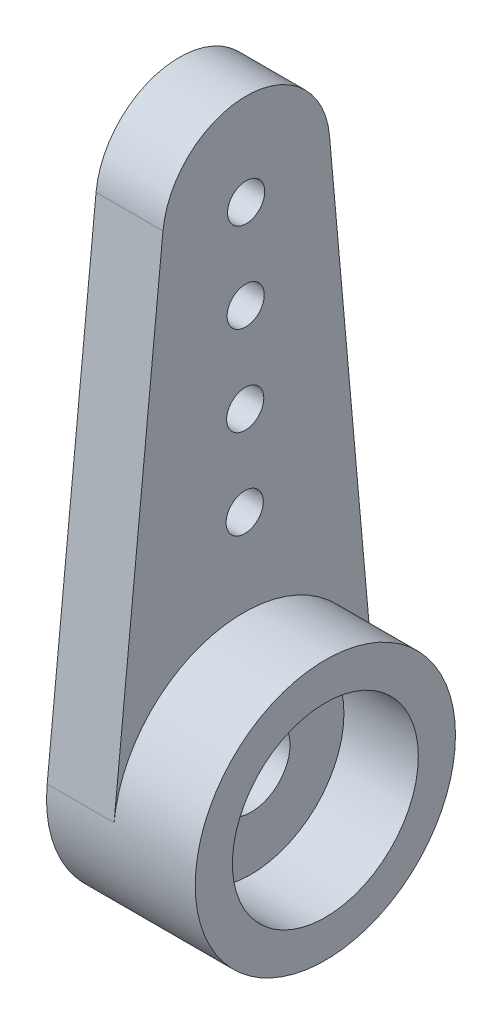
ISO-10303-21;
HEADER;
FILE_DESCRIPTION(('STEP AP214'),'2;1');
FILE_NAME('part.step','',(''),(''),'','','');
FILE_SCHEMA(('AUTOMOTIVE_DESIGN { 1 0 10303 214 1 1 1 1 }'));
ENDSEC;
DATA;
#1=APPLICATION_CONTEXT('core data for automotive mechanical design processes');
#2=APPLICATION_PROTOCOL_DEFINITION('international standard','automotive_design',2000,#1);
#3=PRODUCT_CONTEXT('',#1,'mechanical');
#4=PRODUCT('Part','Part','',(#3));
#5=PRODUCT_RELATED_PRODUCT_CATEGORY('part','',(#4));
#6=PRODUCT_DEFINITION_FORMATION('','',#4);
#7=PRODUCT_DEFINITION_CONTEXT('part definition',#1,'design');
#8=PRODUCT_DEFINITION('design','',#6,#7);
#9=PRODUCT_DEFINITION_SHAPE('','',#8);
#10=(LENGTH_UNIT() NAMED_UNIT(*) SI_UNIT(.MILLI.,.METRE.));
#11=(NAMED_UNIT(*) PLANE_ANGLE_UNIT() SI_UNIT($,.RADIAN.));
#12=(NAMED_UNIT(*) SI_UNIT($,.STERADIAN.) SOLID_ANGLE_UNIT());
#13=UNCERTAINTY_MEASURE_WITH_UNIT(LENGTH_MEASURE(1.E-05),#10,'distance_accuracy_value','');
#14=(GEOMETRIC_REPRESENTATION_CONTEXT(3) GLOBAL_UNCERTAINTY_ASSIGNED_CONTEXT((#13)) GLOBAL_UNIT_ASSIGNED_CONTEXT((#10,
#11,#12)) REPRESENTATION_CONTEXT('',''));
#15=CARTESIAN_POINT('',(0.,0.,0.));
#16=DIRECTION('',(0.,0.,1.));
#17=DIRECTION('',(1.,0.,0.));
#18=AXIS2_PLACEMENT_3D('',#15,#16,#17);
#19=CARTESIAN_POINT('',(4.,415.055894203775,-585.534826128183));
#20=DIRECTION('',(-1.,0.,0.));
#21=DIRECTION('',(0.,0.,1.));
#22=AXIS2_PLACEMENT_3D('',#19,#20,#21);
#23=CYLINDRICAL_SURFACE('',#22,1.04999999999998);
#24=CARTESIAN_POINT('',(0.,415.055894203775,-585.534826128183));
#25=DIRECTION('',(1.,0.,0.));
#26=DIRECTION('',(0.,0.,-1.));
#27=AXIS2_PLACEMENT_3D('',#24,#25,#26);
#28=CIRCLE('',#27,1.04999999999998);
#29=CARTESIAN_POINT('',(0.,415.055894203775,-586.584826128183));
#30=VERTEX_POINT('',#29);
#31=EDGE_CURVE('E99',#30,#30,#28,.T.);
#32=ORIENTED_EDGE('',*,*,#31,.F.);
#33=EDGE_LOOP('',(#32));
#34=FACE_BOUND('',#33,.T.);
#35=CARTESIAN_POINT('',(2.,415.055894203775,-585.534826128183));
#36=DIRECTION('',(1.,0.,0.));
#37=DIRECTION('',(0.,0.,-1.));
#38=AXIS2_PLACEMENT_3D('',#35,#36,#37);
#39=CIRCLE('',#38,1.04999999999998);
#40=CARTESIAN_POINT('',(2.,415.055894203775,-586.584826128183));
#41=VERTEX_POINT('',#40);
#42=EDGE_CURVE('E48',#41,#41,#39,.T.);
#43=ORIENTED_EDGE('',*,*,#42,.T.);
#44=EDGE_LOOP('',(#43));
#45=FACE_BOUND('',#44,.T.);
#46=ADVANCED_FACE('F45',(#34,#45),#23,.F.);
#47=CARTESIAN_POINT('',(4.,415.055894203775,-585.534826128183));
#48=DIRECTION('',(-1.,0.,0.));
#49=DIRECTION('',(0.,0.,1.));
#50=AXIS2_PLACEMENT_3D('',#47,#48,#49);
#51=CYLINDRICAL_SURFACE('',#50,3.49999999999997);
#52=CARTESIAN_POINT('',(1.8,415.055894203775,-585.534826128183));
#53=DIRECTION('',(1.,0.,0.));
#54=DIRECTION('',(0.,0.,-1.));
#55=AXIS2_PLACEMENT_3D('',#52,#53,#54);
#56=CIRCLE('',#55,3.49999999999997);
#57=CARTESIAN_POINT('',(1.8,415.367382833466,-589.020937835167));
#58=VERTEX_POINT('',#57);
#59=CARTESIAN_POINT('',(1.8,415.404762319808,-582.052256525487));
#60=VERTEX_POINT('',#59);
#61=EDGE_CURVE('E62',#58,#60,#56,.T.);
#62=ORIENTED_EDGE('',*,*,#61,.T.);
#63=DIRECTION('',(-1.,0.,0.));
#64=VECTOR('',#63,1.);
#65=CARTESIAN_POINT('',(1.8,415.404762319808,-582.052256525487));
#66=LINE('',#65,#64);
#67=CARTESIAN_POINT('',(0.,415.404762319808,-582.052256525487));
#68=VERTEX_POINT('',#67);
#69=EDGE_CURVE('E100',#60,#68,#66,.T.);
#70=ORIENTED_EDGE('',*,*,#69,.T.);
#71=CARTESIAN_POINT('',(0.,415.055894203775,-585.534826128183));
#72=DIRECTION('',(1.,0.,0.));
#73=DIRECTION('',(0.,0.,-1.));
#74=AXIS2_PLACEMENT_3D('',#71,#72,#73);
#75=CIRCLE('',#74,3.49999999999997);
#76=CARTESIAN_POINT('',(0.,415.367382833466,-589.020937835167));
#77=VERTEX_POINT('',#76);
#78=EDGE_CURVE('E54',#68,#77,#75,.T.);
#79=ORIENTED_EDGE('',*,*,#78,.T.);
#80=DIRECTION('',(-1.,0.,0.));
#81=VECTOR('',#80,1.);
#82=CARTESIAN_POINT('',(1.8,415.367382833466,-589.020937835167));
#83=LINE('',#82,#81);
#84=EDGE_CURVE('E67',#58,#77,#83,.T.);
#85=ORIENTED_EDGE('',*,*,#84,.F.);
#86=EDGE_LOOP('',(#62,#70,#79,#85));
#87=FACE_BOUND('',#86,.T.);
#88=CARTESIAN_POINT('',(4.,415.055894203775,-585.534826128183));
#89=DIRECTION('',(1.,0.,0.));
#90=DIRECTION('',(0.,0.,-1.));
#91=AXIS2_PLACEMENT_3D('',#88,#89,#90);
#92=CIRCLE('',#91,3.49999999999997);
#93=CARTESIAN_POINT('',(4.,415.055894203775,-589.034826128183));
#94=VERTEX_POINT('',#93);
#95=EDGE_CURVE('E11',#94,#94,#92,.T.);
#96=ORIENTED_EDGE('',*,*,#95,.F.);
#97=EDGE_LOOP('',(#96));
#98=FACE_BOUND('',#97,.T.);
#99=ADVANCED_FACE('F156',(#87,#98),#51,.T.);
#100=CARTESIAN_POINT('',(4.,0.,0.));
#101=DIRECTION('',(1.,0.,0.));
#102=DIRECTION('',(0.,0.,-1.));
#103=AXIS2_PLACEMENT_3D('',#100,#101,#102);
#104=PLANE('',#103);
#105=CARTESIAN_POINT('',(4.,415.055894203775,-585.534826128183));
#106=DIRECTION('',(1.,0.,0.));
#107=DIRECTION('',(0.,0.,-1.));
#108=AXIS2_PLACEMENT_3D('',#105,#106,#107);
#109=CIRCLE('',#108,2.49999999999992);
#110=CARTESIAN_POINT('',(4.,415.055894203775,-588.034826128183));
#111=VERTEX_POINT('',#110);
#112=EDGE_CURVE('E205',#111,#111,#109,.T.);
#113=ORIENTED_EDGE('',*,*,#112,.F.);
#114=EDGE_LOOP('',(#113));
#115=FACE_BOUND('',#114,.T.);
#116=ORIENTED_EDGE('',*,*,#95,.T.);
#117=EDGE_LOOP('',(#116));
#118=FACE_BOUND('',#117,.T.);
#119=ADVANCED_FACE('F165',(#115,#118),#104,.T.);
#120=CARTESIAN_POINT('',(0.,0.,0.));
#121=DIRECTION('',(1.,0.,0.));
#122=DIRECTION('',(0.,0.,-1.));
#123=AXIS2_PLACEMENT_3D('',#120,#121,#122);
#124=PLANE('',#123);
#125=ORIENTED_EDGE('',*,*,#31,.T.);
#126=EDGE_LOOP('',(#125));
#127=FACE_BOUND('',#126,.T.);
#128=ORIENTED_EDGE('',*,*,#78,.F.);
#129=DIRECTION('',(0.,0.995019886484311,-0.0996766045807575));
#130=VECTOR('',#129,1.);
#131=CARTESIAN_POINT('',(0.,-53.6008383412623,-535.069390717216));
#132=LINE('',#131,#130);
#133=CARTESIAN_POINT('',(0.,428.53019893154,-583.367103568113));
#134=VERTEX_POINT('',#133);
#135=EDGE_CURVE('E139',#68,#134,#132,.T.);
#136=ORIENTED_EDGE('',*,*,#135,.T.);
#137=CARTESIAN_POINT('',(0.,428.305926571234,-585.605898312703));
#138=DIRECTION('',(1.,0.,0.));
#139=DIRECTION('',(0.,0.,-1.));
#140=AXIS2_PLACEMENT_3D('',#137,#138,#139);
#141=CIRCLE('',#140,2.24999999999999);
#142=CARTESIAN_POINT('',(0.,428.506169261749,-587.846970124335));
#143=VERTEX_POINT('',#142);
#144=EDGE_CURVE('E93',#134,#143,#141,.F.);
#145=ORIENTED_EDGE('',*,*,#144,.T.);
#146=DIRECTION('',(0.,0.996031916281233,0.0889967513403472));
#147=VECTOR('',#146,1.);
#148=CARTESIAN_POINT('',(0.,55.5028240736758,-621.175305710971));
#149=LINE('',#148,#147);
#150=EDGE_CURVE('E142',#77,#143,#149,.T.);
#151=ORIENTED_EDGE('',*,*,#150,.F.);
#152=EDGE_LOOP('',(#128,#136,#145,#151));
#153=FACE_BOUND('',#152,.T.);
#154=CARTESIAN_POINT('',(0.,420.881038800209,-585.566071768958));
#155=DIRECTION('',(1.,0.,0.));
#156=DIRECTION('',(0.,0.,-1.));
#157=AXIS2_PLACEMENT_3D('',#154,#155,#156);
#158=CIRCLE('',#157,0.49999999999992);
#159=CARTESIAN_POINT('',(0.,420.881038800209,-586.066071768958));
#160=VERTEX_POINT('',#159);
#161=EDGE_CURVE('E121',#160,#160,#158,.T.);
#162=ORIENTED_EDGE('',*,*,#161,.T.);
#163=EDGE_LOOP('',(#162));
#164=FACE_BOUND('',#163,.T.);
#165=CARTESIAN_POINT('',(0.,423.281038800209,-585.578945189801));
#166=DIRECTION('',(1.,0.,0.));
#167=DIRECTION('',(0.,0.,-1.));
#168=AXIS2_PLACEMENT_3D('',#165,#166,#167);
#169=CIRCLE('',#168,0.49999999999992);
#170=CARTESIAN_POINT('',(0.,423.281038800209,-586.078945189801));
#171=VERTEX_POINT('',#170);
#172=EDGE_CURVE('E125',#171,#171,#169,.T.);
#173=ORIENTED_EDGE('',*,*,#172,.T.);
#174=EDGE_LOOP('',(#173));
#175=FACE_BOUND('',#174,.T.);
#176=CARTESIAN_POINT('',(0.,425.681038800209,-585.591818610644));
#177=DIRECTION('',(1.,0.,0.));
#178=DIRECTION('',(0.,0.,-1.));
#179=AXIS2_PLACEMENT_3D('',#176,#177,#178);
#180=CIRCLE('',#179,0.49999999999992);
#181=CARTESIAN_POINT('',(0.,425.681038800209,-586.091818610643));
#182=VERTEX_POINT('',#181);
#183=EDGE_CURVE('E129',#182,#182,#180,.T.);
#184=ORIENTED_EDGE('',*,*,#183,.T.);
#185=EDGE_LOOP('',(#184));
#186=FACE_BOUND('',#185,.T.);
#187=CARTESIAN_POINT('',(0.,428.081038800209,-585.604692031486));
#188=DIRECTION('',(1.,0.,0.));
#189=DIRECTION('',(0.,0.,-1.));
#190=AXIS2_PLACEMENT_3D('',#187,#188,#189);
#191=CIRCLE('',#190,0.49999999999992);
#192=CARTESIAN_POINT('',(0.,428.081038800209,-586.104692031486));
#193=VERTEX_POINT('',#192);
#194=EDGE_CURVE('E133',#193,#193,#191,.T.);
#195=ORIENTED_EDGE('',*,*,#194,.T.);
#196=EDGE_LOOP('',(#195));
#197=FACE_BOUND('',#196,.T.);
#198=ADVANCED_FACE('F162',(#127,#153,#164,#175,#186,#197),#124,.F.);
#199=CARTESIAN_POINT('',(1.8,428.305926571234,-585.605898312703));
#200=DIRECTION('',(-1.,0.,0.));
#201=DIRECTION('',(0.,0.,1.));
#202=AXIS2_PLACEMENT_3D('',#199,#200,#201);
#203=CYLINDRICAL_SURFACE('',#202,2.24999999999999);
#204=ORIENTED_EDGE('',*,*,#144,.F.);
#205=DIRECTION('',(-1.,0.,0.));
#206=VECTOR('',#205,1.);
#207=CARTESIAN_POINT('',(1.8,428.53019893154,-583.367103568113));
#208=LINE('',#207,#206);
#209=CARTESIAN_POINT('',(1.8,428.53019893154,-583.367103568113));
#210=VERTEX_POINT('',#209);
#211=EDGE_CURVE('E88',#210,#134,#208,.T.);
#212=ORIENTED_EDGE('',*,*,#211,.F.);
#213=CARTESIAN_POINT('',(1.8,428.305926571234,-585.605898312703));
#214=DIRECTION('',(1.,0.,0.));
#215=DIRECTION('',(0.,0.,-1.));
#216=AXIS2_PLACEMENT_3D('',#213,#214,#215);
#217=CIRCLE('',#216,2.24999999999999);
#218=CARTESIAN_POINT('',(1.8,428.506169261749,-587.846970124335));
#219=VERTEX_POINT('',#218);
#220=EDGE_CURVE('E91',#210,#219,#217,.F.);
#221=ORIENTED_EDGE('',*,*,#220,.T.);
#222=DIRECTION('',(-1.,0.,0.));
#223=VECTOR('',#222,1.);
#224=CARTESIAN_POINT('',(1.8,428.506169261749,-587.846970124335));
#225=LINE('',#224,#223);
#226=EDGE_CURVE('E120',#219,#143,#225,.T.);
#227=ORIENTED_EDGE('',*,*,#226,.T.);
#228=EDGE_LOOP('',(#204,#212,#221,#227));
#229=FACE_BOUND('',#228,.T.);
#230=ADVANCED_FACE('F90',(#229),#203,.T.);
#231=CARTESIAN_POINT('',(1.8,-53.6008383412623,-535.069390717216));
#232=DIRECTION('',(0.,0.0996766045807575,0.995019886484311));
#233=DIRECTION('',(0.,-0.995019886484311,0.0996766045807575));
#234=AXIS2_PLACEMENT_3D('',#231,#232,#233);
#235=PLANE('',#234);
#236=ORIENTED_EDGE('',*,*,#135,.F.);
#237=ORIENTED_EDGE('',*,*,#69,.F.);
#238=DIRECTION('',(0.,0.995019886484311,-0.0996766045807575));
#239=VECTOR('',#238,1.);
#240=CARTESIAN_POINT('',(1.8,-53.6008383412623,-535.069390717216));
#241=LINE('',#240,#239);
#242=EDGE_CURVE('E105',#60,#210,#241,.T.);
#243=ORIENTED_EDGE('',*,*,#242,.T.);
#244=ORIENTED_EDGE('',*,*,#211,.T.);
#245=EDGE_LOOP('',(#236,#237,#243,#244));
#246=FACE_BOUND('',#245,.T.);
#247=ADVANCED_FACE('F111',(#246),#235,.T.);
#248=CARTESIAN_POINT('',(1.8,428.081038800209,-585.604692031486));
#249=DIRECTION('',(-1.,0.,0.));
#250=DIRECTION('',(0.,0.,1.));
#251=AXIS2_PLACEMENT_3D('',#248,#249,#250);
#252=CYLINDRICAL_SURFACE('',#251,0.49999999999992);
#253=CARTESIAN_POINT('',(1.8,428.081038800209,-585.604692031486));
#254=DIRECTION('',(1.,0.,0.));
#255=DIRECTION('',(0.,0.,-1.));
#256=AXIS2_PLACEMENT_3D('',#253,#254,#255);
#257=CIRCLE('',#256,0.49999999999992);
#258=CARTESIAN_POINT('',(1.8,428.081038800209,-586.104692031486));
#259=VERTEX_POINT('',#258);
#260=EDGE_CURVE('E109',#259,#259,#257,.T.);
#261=ORIENTED_EDGE('',*,*,#260,.T.);
#262=EDGE_LOOP('',(#261));
#263=FACE_BOUND('',#262,.T.);
#264=ORIENTED_EDGE('',*,*,#194,.F.);
#265=EDGE_LOOP('',(#264));
#266=FACE_BOUND('',#265,.T.);
#267=ADVANCED_FACE('F176',(#263,#266),#252,.F.);
#268=CARTESIAN_POINT('',(1.8,425.681038800209,-585.591818610644));
#269=DIRECTION('',(-1.,0.,0.));
#270=DIRECTION('',(0.,0.,1.));
#271=AXIS2_PLACEMENT_3D('',#268,#269,#270);
#272=CYLINDRICAL_SURFACE('',#271,0.49999999999992);
#273=CARTESIAN_POINT('',(1.8,425.681038800209,-585.591818610644));
#274=DIRECTION('',(1.,0.,0.));
#275=DIRECTION('',(0.,0.,-1.));
#276=AXIS2_PLACEMENT_3D('',#273,#274,#275);
#277=CIRCLE('',#276,0.49999999999992);
#278=CARTESIAN_POINT('',(1.8,425.681038800209,-586.091818610643));
#279=VERTEX_POINT('',#278);
#280=EDGE_CURVE('E220',#279,#279,#277,.T.);
#281=ORIENTED_EDGE('',*,*,#280,.T.);
#282=EDGE_LOOP('',(#281));
#283=FACE_BOUND('',#282,.T.);
#284=ORIENTED_EDGE('',*,*,#183,.F.);
#285=EDGE_LOOP('',(#284));
#286=FACE_BOUND('',#285,.T.);
#287=ADVANCED_FACE('F178',(#283,#286),#272,.F.);
#288=CARTESIAN_POINT('',(1.8,423.281038800209,-585.578945189801));
#289=DIRECTION('',(-1.,0.,0.));
#290=DIRECTION('',(0.,0.,1.));
#291=AXIS2_PLACEMENT_3D('',#288,#289,#290);
#292=CYLINDRICAL_SURFACE('',#291,0.49999999999992);
#293=CARTESIAN_POINT('',(1.8,423.281038800209,-585.578945189801));
#294=DIRECTION('',(1.,0.,0.));
#295=DIRECTION('',(0.,0.,-1.));
#296=AXIS2_PLACEMENT_3D('',#293,#294,#295);
#297=CIRCLE('',#296,0.49999999999992);
#298=CARTESIAN_POINT('',(1.8,423.281038800209,-586.078945189801));
#299=VERTEX_POINT('',#298);
#300=EDGE_CURVE('E216',#299,#299,#297,.T.);
#301=ORIENTED_EDGE('',*,*,#300,.T.);
#302=EDGE_LOOP('',(#301));
#303=FACE_BOUND('',#302,.T.);
#304=ORIENTED_EDGE('',*,*,#172,.F.);
#305=EDGE_LOOP('',(#304));
#306=FACE_BOUND('',#305,.T.);
#307=ADVANCED_FACE('F185',(#303,#306),#292,.F.);
#308=CARTESIAN_POINT('',(1.8,420.881038800209,-585.566071768958));
#309=DIRECTION('',(-1.,0.,0.));
#310=DIRECTION('',(0.,0.,1.));
#311=AXIS2_PLACEMENT_3D('',#308,#309,#310);
#312=CYLINDRICAL_SURFACE('',#311,0.49999999999992);
#313=CARTESIAN_POINT('',(1.8,420.881038800209,-585.566071768958));
#314=DIRECTION('',(1.,0.,0.));
#315=DIRECTION('',(0.,0.,-1.));
#316=AXIS2_PLACEMENT_3D('',#313,#314,#315);
#317=CIRCLE('',#316,0.49999999999992);
#318=CARTESIAN_POINT('',(1.8,420.881038800209,-586.066071768958));
#319=VERTEX_POINT('',#318);
#320=EDGE_CURVE('E146',#319,#319,#317,.T.);
#321=ORIENTED_EDGE('',*,*,#320,.T.);
#322=EDGE_LOOP('',(#321));
#323=FACE_BOUND('',#322,.T.);
#324=ORIENTED_EDGE('',*,*,#161,.F.);
#325=EDGE_LOOP('',(#324));
#326=FACE_BOUND('',#325,.T.);
#327=ADVANCED_FACE('F237',(#323,#326),#312,.F.);
#328=CARTESIAN_POINT('',(1.8,55.5028240736758,-621.175305710971));
#329=DIRECTION('',(0.,-0.0889967513403472,0.996031916281233));
#330=DIRECTION('',(0.,-0.996031916281233,-0.0889967513403472));
#331=AXIS2_PLACEMENT_3D('',#328,#329,#330);
#332=PLANE('',#331);
#333=ORIENTED_EDGE('',*,*,#150,.T.);
#334=ORIENTED_EDGE('',*,*,#226,.F.);
#335=DIRECTION('',(0.,0.996031916281233,0.0889967513403472));
#336=VECTOR('',#335,1.);
#337=CARTESIAN_POINT('',(1.8,55.5028240736758,-621.175305710971));
#338=LINE('',#337,#336);
#339=EDGE_CURVE('E106',#58,#219,#338,.T.);
#340=ORIENTED_EDGE('',*,*,#339,.F.);
#341=ORIENTED_EDGE('',*,*,#84,.T.);
#342=EDGE_LOOP('',(#333,#334,#340,#341));
#343=FACE_BOUND('',#342,.T.);
#344=ADVANCED_FACE('F161',(#343),#332,.F.);
#345=CARTESIAN_POINT('',(1.8,0.,0.));
#346=DIRECTION('',(1.,0.,0.));
#347=DIRECTION('',(0.,0.,-1.));
#348=AXIS2_PLACEMENT_3D('',#345,#346,#347);
#349=PLANE('',#348);
#350=ORIENTED_EDGE('',*,*,#320,.F.);
#351=EDGE_LOOP('',(#350));
#352=FACE_BOUND('',#351,.T.);
#353=ORIENTED_EDGE('',*,*,#300,.F.);
#354=EDGE_LOOP('',(#353));
#355=FACE_BOUND('',#354,.T.);
#356=ORIENTED_EDGE('',*,*,#280,.F.);
#357=EDGE_LOOP('',(#356));
#358=FACE_BOUND('',#357,.T.);
#359=ORIENTED_EDGE('',*,*,#260,.F.);
#360=EDGE_LOOP('',(#359));
#361=FACE_BOUND('',#360,.T.);
#362=ORIENTED_EDGE('',*,*,#220,.F.);
#363=ORIENTED_EDGE('',*,*,#242,.F.);
#364=ORIENTED_EDGE('',*,*,#61,.F.);
#365=ORIENTED_EDGE('',*,*,#339,.T.);
#366=EDGE_LOOP('',(#362,#363,#364,#365));
#367=FACE_BOUND('',#366,.T.);
#368=ADVANCED_FACE('F104',(#352,#355,#358,#361,#367),#349,.T.);
#369=CARTESIAN_POINT('',(2.,415.055894203775,-585.534826128183));
#370=DIRECTION('',(1.,0.,0.));
#371=DIRECTION('',(0.,0.,-1.));
#372=AXIS2_PLACEMENT_3D('',#369,#370,#371);
#373=CYLINDRICAL_SURFACE('',#372,2.49999999999992);
#374=CARTESIAN_POINT('',(2.,415.055894203775,-585.534826128183));
#375=DIRECTION('',(1.,0.,0.));
#376=DIRECTION('',(0.,0.,-1.));
#377=AXIS2_PLACEMENT_3D('',#374,#375,#376);
#378=CIRCLE('',#377,2.49999999999992);
#379=CARTESIAN_POINT('',(2.,415.055894203775,-588.034826128183));
#380=VERTEX_POINT('',#379);
#381=EDGE_CURVE('E202',#380,#380,#378,.T.);
#382=ORIENTED_EDGE('',*,*,#381,.F.);
#383=EDGE_LOOP('',(#382));
#384=FACE_BOUND('',#383,.T.);
#385=ORIENTED_EDGE('',*,*,#112,.T.);
#386=EDGE_LOOP('',(#385));
#387=FACE_BOUND('',#386,.T.);
#388=ADVANCED_FACE('F227',(#384,#387),#373,.F.);
#389=CARTESIAN_POINT('',(2.,415.055894203775,-585.534826128183));
#390=DIRECTION('',(1.,0.,0.));
#391=DIRECTION('',(0.,0.,-1.));
#392=AXIS2_PLACEMENT_3D('',#389,#390,#391);
#393=PLANE('',#392);
#394=ORIENTED_EDGE('',*,*,#42,.F.);
#395=EDGE_LOOP('',(#394));
#396=FACE_BOUND('',#395,.T.);
#397=ORIENTED_EDGE('',*,*,#381,.T.);
#398=EDGE_LOOP('',(#397));
#399=FACE_BOUND('',#398,.T.);
#400=ADVANCED_FACE('F234',(#396,#399),#393,.T.);
#401=CLOSED_SHELL('',(#46,#99,#119,#198,#230,#247,#267,#287,#307,#327,#344,#368,#388,#400));
#402=MANIFOLD_SOLID_BREP('B2',#401);
#403=ADVANCED_BREP_SHAPE_REPRESENTATION('',(#18,#402),#14);
#404=SHAPE_DEFINITION_REPRESENTATION(#9,#403);
ENDSEC;
END-ISO-10303-21;
